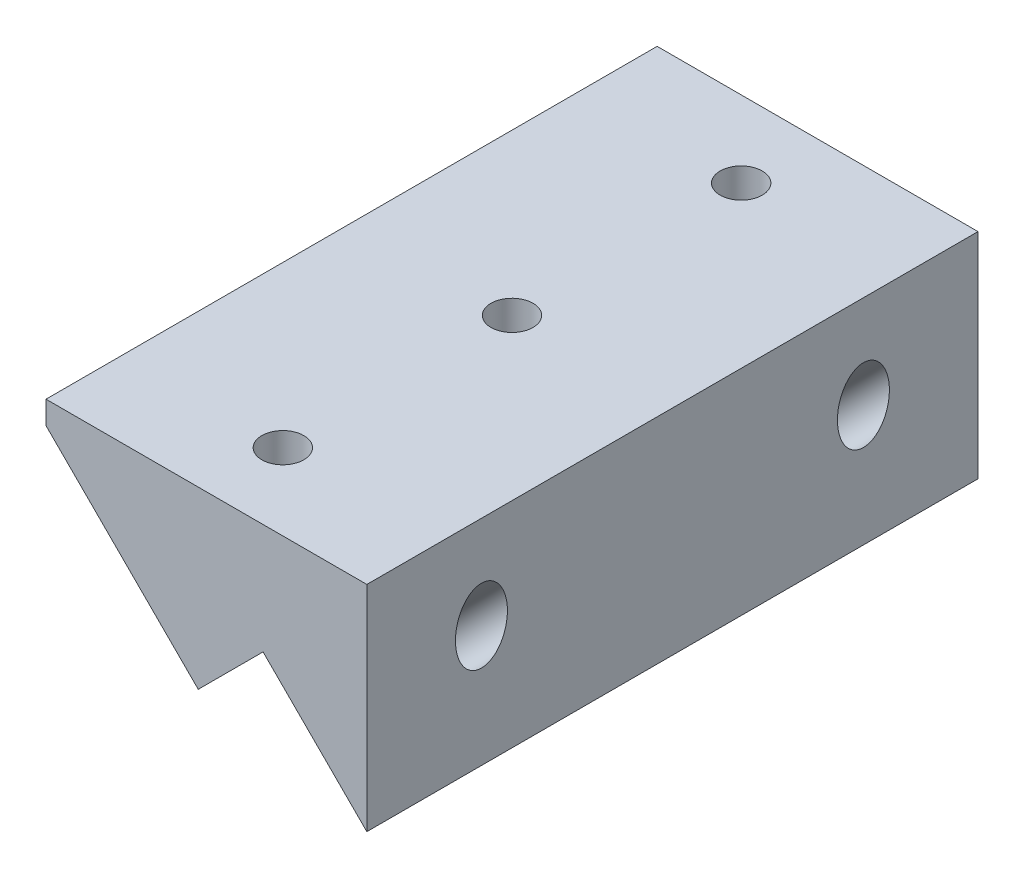
ISO-10303-21;
HEADER;
FILE_DESCRIPTION(('STEP AP214'),'2;1');
FILE_NAME('part.step','',(''),(''),'','','');
FILE_SCHEMA(('AUTOMOTIVE_DESIGN { 1 0 10303 214 1 1 1 1 }'));
ENDSEC;
DATA;
#1=APPLICATION_CONTEXT('core data for automotive mechanical design processes');
#2=APPLICATION_PROTOCOL_DEFINITION('international standard','automotive_design',2000,#1);
#3=PRODUCT_CONTEXT('',#1,'mechanical');
#4=PRODUCT('Part','Part','',(#3));
#5=PRODUCT_RELATED_PRODUCT_CATEGORY('part','',(#4));
#6=PRODUCT_DEFINITION_FORMATION('','',#4);
#7=PRODUCT_DEFINITION_CONTEXT('part definition',#1,'design');
#8=PRODUCT_DEFINITION('design','',#6,#7);
#9=PRODUCT_DEFINITION_SHAPE('','',#8);
#10=(LENGTH_UNIT() NAMED_UNIT(*) SI_UNIT(.MILLI.,.METRE.));
#11=(NAMED_UNIT(*) PLANE_ANGLE_UNIT() SI_UNIT($,.RADIAN.));
#12=(NAMED_UNIT(*) SI_UNIT($,.STERADIAN.) SOLID_ANGLE_UNIT());
#13=UNCERTAINTY_MEASURE_WITH_UNIT(LENGTH_MEASURE(1.E-05),#10,'distance_accuracy_value','');
#14=(GEOMETRIC_REPRESENTATION_CONTEXT(3) GLOBAL_UNCERTAINTY_ASSIGNED_CONTEXT((#13)) GLOBAL_UNIT_ASSIGNED_CONTEXT((#10,
#11,#12)) REPRESENTATION_CONTEXT('',''));
#15=CARTESIAN_POINT('',(0.,0.,0.));
#16=DIRECTION('',(0.,0.,1.));
#17=DIRECTION('',(1.,0.,0.));
#18=AXIS2_PLACEMENT_3D('',#15,#16,#17);
#19=CARTESIAN_POINT('',(21.,-15.,40.));
#20=DIRECTION('',(-1.,0.,0.));
#21=DIRECTION('',(0.,0.,1.));
#22=AXIS2_PLACEMENT_3D('',#19,#20,#21);
#23=PLANE('',#22);
#24=CARTESIAN_POINT('',(21.,2.82842712474589,-25.));
#25=DIRECTION('',(-1.,0.,0.));
#26=DIRECTION('',(0.,-1.,0.));
#27=AXIS2_PLACEMENT_3D('',#24,#25,#26);
#28=ELLIPSE('',#27,4.80832611206852,3.4);
#29=CARTESIAN_POINT('',(21.,-1.97989898732263,-25.));
#30=VERTEX_POINT('',#29);
#31=EDGE_CURVE('E250',#30,#30,#28,.T.);
#32=ORIENTED_EDGE('',*,*,#31,.T.);
#33=EDGE_LOOP('',(#32));
#34=FACE_BOUND('',#33,.T.);
#35=CARTESIAN_POINT('',(21.,2.82842712474589,25.));
#36=DIRECTION('',(-1.,0.,0.));
#37=DIRECTION('',(0.,-1.,0.));
#38=AXIS2_PLACEMENT_3D('',#35,#36,#37);
#39=ELLIPSE('',#38,4.80832611206852,3.4);
#40=CARTESIAN_POINT('',(21.,-1.97989898732263,25.));
#41=VERTEX_POINT('',#40);
#42=EDGE_CURVE('E134',#41,#41,#39,.T.);
#43=ORIENTED_EDGE('',*,*,#42,.T.);
#44=EDGE_LOOP('',(#43));
#45=FACE_BOUND('',#44,.T.);
#46=DIRECTION('',(0.,1.,0.));
#47=VECTOR('',#46,1.);
#48=CARTESIAN_POINT('',(21.,-15.,40.));
#49=LINE('',#48,#47);
#50=CARTESIAN_POINT('',(21.,-13.0294372515226,40.));
#51=VERTEX_POINT('',#50);
#52=CARTESIAN_POINT('',(21.,15.,40.));
#53=VERTEX_POINT('',#52);
#54=EDGE_CURVE('E184',#51,#53,#49,.T.);
#55=ORIENTED_EDGE('',*,*,#54,.F.);
#56=DIRECTION('',(0.,0.,-1.));
#57=VECTOR('',#56,1.);
#58=CARTESIAN_POINT('',(21.,-13.0294372515226,40.));
#59=LINE('',#58,#57);
#60=CARTESIAN_POINT('',(21.,-13.0294372515226,-40.));
#61=VERTEX_POINT('',#60);
#62=EDGE_CURVE('E146',#51,#61,#59,.T.);
#63=ORIENTED_EDGE('',*,*,#62,.T.);
#64=DIRECTION('',(0.,1.,0.));
#65=VECTOR('',#64,1.);
#66=CARTESIAN_POINT('',(21.,-15.,-40.));
#67=LINE('',#66,#65);
#68=CARTESIAN_POINT('',(21.,15.,-40.));
#69=VERTEX_POINT('',#68);
#70=EDGE_CURVE('E129',#61,#69,#67,.T.);
#71=ORIENTED_EDGE('',*,*,#70,.T.);
#72=DIRECTION('',(0.,0.,-1.));
#73=VECTOR('',#72,1.);
#74=CARTESIAN_POINT('',(21.,15.,40.));
#75=LINE('',#74,#73);
#76=EDGE_CURVE('E48',#53,#69,#75,.T.);
#77=ORIENTED_EDGE('',*,*,#76,.F.);
#78=EDGE_LOOP('',(#55,#63,#71,#77));
#79=FACE_BOUND('',#78,.T.);
#80=ADVANCED_FACE('F41',(#34,#45,#79),#23,.F.);
#81=CARTESIAN_POINT('',(-21.,15.,40.));
#82=DIRECTION('',(0.,-1.,0.));
#83=DIRECTION('',(0.,0.,-1.));
#84=AXIS2_PLACEMENT_3D('',#81,#82,#83);
#85=PLANE('',#84);
#86=CARTESIAN_POINT('',(0.,15.,30.));
#87=DIRECTION('',(0.,-1.,0.));
#88=DIRECTION('',(0.,0.,-1.));
#89=AXIS2_PLACEMENT_3D('',#86,#87,#88);
#90=CIRCLE('',#89,2.74999999999999);
#91=CARTESIAN_POINT('',(0.,15.,27.25));
#92=VERTEX_POINT('',#91);
#93=EDGE_CURVE('E154',#92,#92,#90,.T.);
#94=ORIENTED_EDGE('',*,*,#93,.T.);
#95=EDGE_LOOP('',(#94));
#96=FACE_BOUND('',#95,.T.);
#97=CARTESIAN_POINT('',(0.,15.,-30.));
#98=DIRECTION('',(0.,-1.,0.));
#99=DIRECTION('',(0.,0.,-1.));
#100=AXIS2_PLACEMENT_3D('',#97,#98,#99);
#101=CIRCLE('',#100,2.74999999999999);
#102=CARTESIAN_POINT('',(0.,15.,-32.75));
#103=VERTEX_POINT('',#102);
#104=EDGE_CURVE('E164',#103,#103,#101,.T.);
#105=ORIENTED_EDGE('',*,*,#104,.T.);
#106=EDGE_LOOP('',(#105));
#107=FACE_BOUND('',#106,.T.);
#108=CARTESIAN_POINT('',(0.,15.,0.));
#109=DIRECTION('',(0.,-1.,0.));
#110=DIRECTION('',(0.,0.,-1.));
#111=AXIS2_PLACEMENT_3D('',#108,#109,#110);
#112=CIRCLE('',#111,2.74999999999999);
#113=CARTESIAN_POINT('',(0.,15.,-2.74999999999999));
#114=VERTEX_POINT('',#113);
#115=EDGE_CURVE('E174',#114,#114,#112,.T.);
#116=ORIENTED_EDGE('',*,*,#115,.T.);
#117=EDGE_LOOP('',(#116));
#118=FACE_BOUND('',#117,.T.);
#119=DIRECTION('',(-1.,0.,0.));
#120=VECTOR('',#119,1.);
#121=CARTESIAN_POINT('',(-21.,15.,-40.));
#122=LINE('',#121,#120);
#123=CARTESIAN_POINT('',(-21.,15.,-40.));
#124=VERTEX_POINT('',#123);
#125=EDGE_CURVE('E194',#69,#124,#122,.T.);
#126=ORIENTED_EDGE('',*,*,#125,.T.);
#127=DIRECTION('',(0.,0.,-1.));
#128=VECTOR('',#127,1.);
#129=CARTESIAN_POINT('',(-21.,15.,40.));
#130=LINE('',#129,#128);
#131=CARTESIAN_POINT('',(-21.,15.,40.));
#132=VERTEX_POINT('',#131);
#133=EDGE_CURVE('E192',#132,#124,#130,.T.);
#134=ORIENTED_EDGE('',*,*,#133,.F.);
#135=DIRECTION('',(-1.,0.,0.));
#136=VECTOR('',#135,1.);
#137=CARTESIAN_POINT('',(-21.,15.,40.));
#138=LINE('',#137,#136);
#139=EDGE_CURVE('E186',#53,#132,#138,.T.);
#140=ORIENTED_EDGE('',*,*,#139,.F.);
#141=ORIENTED_EDGE('',*,*,#76,.T.);
#142=EDGE_LOOP('',(#126,#134,#140,#141));
#143=FACE_BOUND('',#142,.T.);
#144=ADVANCED_FACE('F240',(#96,#107,#118,#143),#85,.F.);
#145=CARTESIAN_POINT('',(-21.,-15.,40.));
#146=DIRECTION('',(1.,0.,0.));
#147=DIRECTION('',(0.,0.,-1.));
#148=AXIS2_PLACEMENT_3D('',#145,#146,#147);
#149=PLANE('',#148);
#150=DIRECTION('',(0.,-1.,0.));
#151=VECTOR('',#150,1.);
#152=CARTESIAN_POINT('',(-21.,-15.,-40.));
#153=LINE('',#152,#151);
#154=CARTESIAN_POINT('',(-21.,12.,-40.));
#155=VERTEX_POINT('',#154);
#156=EDGE_CURVE('E187',#124,#155,#153,.T.);
#157=ORIENTED_EDGE('',*,*,#156,.T.);
#158=DIRECTION('',(0.,0.,1.));
#159=VECTOR('',#158,1.);
#160=CARTESIAN_POINT('',(-21.,12.,-40.));
#161=LINE('',#160,#159);
#162=CARTESIAN_POINT('',(-21.,12.,40.));
#163=VERTEX_POINT('',#162);
#164=EDGE_CURVE('E179',#155,#163,#161,.T.);
#165=ORIENTED_EDGE('',*,*,#164,.T.);
#166=DIRECTION('',(0.,-1.,0.));
#167=VECTOR('',#166,1.);
#168=CARTESIAN_POINT('',(-21.,-15.,40.));
#169=LINE('',#168,#167);
#170=EDGE_CURVE('E189',#132,#163,#169,.T.);
#171=ORIENTED_EDGE('',*,*,#170,.F.);
#172=ORIENTED_EDGE('',*,*,#133,.T.);
#173=EDGE_LOOP('',(#157,#165,#171,#172));
#174=FACE_BOUND('',#173,.T.);
#175=ADVANCED_FACE('F245',(#174),#149,.F.);
#176=CARTESIAN_POINT('',(0.,0.,40.));
#177=DIRECTION('',(0.,0.,-1.));
#178=DIRECTION('',(-1.,0.,0.));
#179=AXIS2_PLACEMENT_3D('',#176,#177,#178);
#180=PLANE('',#179);
#181=DIRECTION('',(-0.707106781186552,0.707106781186544,0.));
#182=VECTOR('',#181,1.);
#183=CARTESIAN_POINT('',(-21.,12.,40.));
#184=LINE('',#183,#182);
#185=CARTESIAN_POINT('',(-1.07106781186517,-7.92893218813453,40.));
#186=VERTEX_POINT('',#185);
#187=EDGE_CURVE('E180',#186,#163,#184,.T.);
#188=ORIENTED_EDGE('',*,*,#187,.F.);
#189=DIRECTION('',(-0.707106781186547,-0.707106781186548,0.));
#190=VECTOR('',#189,1.);
#191=CARTESIAN_POINT('',(-1.07106781186517,-7.92893218813453,40.));
#192=LINE('',#191,#190);
#193=CARTESIAN_POINT('',(7.4142135623734,0.556349186104048,40.));
#194=VERTEX_POINT('',#193);
#195=EDGE_CURVE('E130',#194,#186,#192,.T.);
#196=ORIENTED_EDGE('',*,*,#195,.F.);
#197=DIRECTION('',(-0.707106781186548,0.707106781186547,0.));
#198=VECTOR('',#197,1.);
#199=CARTESIAN_POINT('',(7.4142135623734,0.556349186104048,40.));
#200=LINE('',#199,#198);
#201=EDGE_CURVE('E118',#51,#194,#200,.T.);
#202=ORIENTED_EDGE('',*,*,#201,.F.);
#203=ORIENTED_EDGE('',*,*,#54,.T.);
#204=ORIENTED_EDGE('',*,*,#139,.T.);
#205=ORIENTED_EDGE('',*,*,#170,.T.);
#206=EDGE_LOOP('',(#188,#196,#202,#203,#204,#205));
#207=FACE_BOUND('',#206,.T.);
#208=ADVANCED_FACE('F258',(#207),#180,.F.);
#209=CARTESIAN_POINT('',(0.,0.,-40.));
#210=DIRECTION('',(0.,0.,-1.));
#211=DIRECTION('',(-1.,0.,0.));
#212=AXIS2_PLACEMENT_3D('',#209,#210,#211);
#213=PLANE('',#212);
#214=DIRECTION('',(-0.707106781186547,-0.707106781186548,0.));
#215=VECTOR('',#214,1.);
#216=CARTESIAN_POINT('',(-1.07106781186517,-7.92893218813453,-40.));
#217=LINE('',#216,#215);
#218=CARTESIAN_POINT('',(7.4142135623734,0.556349186104048,-40.));
#219=VERTEX_POINT('',#218);
#220=CARTESIAN_POINT('',(-1.07106781186517,-7.92893218813453,-40.));
#221=VERTEX_POINT('',#220);
#222=EDGE_CURVE('E120',#219,#221,#217,.T.);
#223=ORIENTED_EDGE('',*,*,#222,.T.);
#224=DIRECTION('',(-0.707106781186552,0.707106781186544,0.));
#225=VECTOR('',#224,1.);
#226=CARTESIAN_POINT('',(-21.,12.,-40.));
#227=LINE('',#226,#225);
#228=EDGE_CURVE('E62',#221,#155,#227,.T.);
#229=ORIENTED_EDGE('',*,*,#228,.T.);
#230=ORIENTED_EDGE('',*,*,#156,.F.);
#231=ORIENTED_EDGE('',*,*,#125,.F.);
#232=ORIENTED_EDGE('',*,*,#70,.F.);
#233=DIRECTION('',(-0.707106781186548,0.707106781186547,0.));
#234=VECTOR('',#233,1.);
#235=CARTESIAN_POINT('',(7.4142135623734,0.556349186104048,-40.));
#236=LINE('',#235,#234);
#237=EDGE_CURVE('E115',#61,#219,#236,.T.);
#238=ORIENTED_EDGE('',*,*,#237,.T.);
#239=EDGE_LOOP('',(#223,#229,#230,#231,#232,#238));
#240=FACE_BOUND('',#239,.T.);
#241=ADVANCED_FACE('F127',(#240),#213,.T.);
#242=CARTESIAN_POINT('',(-21.,12.,-40.));
#243=DIRECTION('',(0.707106781186544,0.707106781186552,0.));
#244=DIRECTION('',(-0.707106781186552,0.707106781186544,0.));
#245=AXIS2_PLACEMENT_3D('',#242,#243,#244);
#246=PLANE('',#245);
#247=ORIENTED_EDGE('',*,*,#228,.F.);
#248=DIRECTION('',(0.,0.,1.));
#249=VECTOR('',#248,1.);
#250=CARTESIAN_POINT('',(-1.07106781186517,-7.92893218813453,-40.));
#251=LINE('',#250,#249);
#252=CARTESIAN_POINT('',(-1.07106781186517,-7.92893218813453,-34.8839342483684));
#253=VERTEX_POINT('',#252);
#254=EDGE_CURVE('E124',#221,#253,#251,.T.);
#255=ORIENTED_EDGE('',*,*,#254,.T.);
#256=CARTESIAN_POINT('',(0.,-8.99999999999975,-30.));
#257=DIRECTION('',(0.707106781186544,0.707106781186552,0.));
#258=DIRECTION('',(0.707106781186552,-0.707106781186544,0.));
#259=AXIS2_PLACEMENT_3D('',#256,#257,#258);
#260=ELLIPSE('',#259,7.07106781186543,5.);
#261=CARTESIAN_POINT('',(-1.07106781186517,-7.92893218813453,-25.1160657516315));
#262=VERTEX_POINT('',#261);
#263=EDGE_CURVE('E167',#253,#262,#260,.T.);
#264=ORIENTED_EDGE('',*,*,#263,.T.);
#265=CARTESIAN_POINT('',(-1.07106781186517,-7.92893218813453,-4.88393424836845));
#266=VERTEX_POINT('',#265);
#267=EDGE_CURVE('E139',#262,#266,#251,.T.);
#268=ORIENTED_EDGE('',*,*,#267,.T.);
#269=CARTESIAN_POINT('',(0.,-8.99999999999976,0.));
#270=DIRECTION('',(0.707106781186544,0.707106781186552,0.));
#271=DIRECTION('',(0.707106781186552,-0.707106781186544,0.));
#272=AXIS2_PLACEMENT_3D('',#269,#270,#271);
#273=ELLIPSE('',#272,7.07106781186543,5.);
#274=CARTESIAN_POINT('',(-1.07106781186517,-7.92893218813453,4.88393424836845));
#275=VERTEX_POINT('',#274);
#276=EDGE_CURVE('E177',#266,#275,#273,.T.);
#277=ORIENTED_EDGE('',*,*,#276,.T.);
#278=CARTESIAN_POINT('',(-1.07106781186517,-7.92893218813453,25.1160657516315));
#279=VERTEX_POINT('',#278);
#280=EDGE_CURVE('E211',#275,#279,#251,.T.);
#281=ORIENTED_EDGE('',*,*,#280,.T.);
#282=CARTESIAN_POINT('',(0.,-8.99999999999975,30.));
#283=DIRECTION('',(0.707106781186544,0.707106781186552,0.));
#284=DIRECTION('',(0.707106781186552,-0.707106781186544,0.));
#285=AXIS2_PLACEMENT_3D('',#282,#283,#284);
#286=ELLIPSE('',#285,7.07106781186543,5.);
#287=CARTESIAN_POINT('',(-1.07106781186521,-7.92893218813456,34.8839342483684));
#288=VERTEX_POINT('',#287);
#289=EDGE_CURVE('E157',#279,#288,#286,.T.);
#290=ORIENTED_EDGE('',*,*,#289,.T.);
#291=EDGE_CURVE('E55',#288,#186,#251,.T.);
#292=ORIENTED_EDGE('',*,*,#291,.T.);
#293=ORIENTED_EDGE('',*,*,#187,.T.);
#294=ORIENTED_EDGE('',*,*,#164,.F.);
#295=EDGE_LOOP('',(#247,#255,#264,#268,#277,#281,#290,#292,#293,#294));
#296=FACE_BOUND('',#295,.T.);
#297=ADVANCED_FACE('F209',(#296),#246,.F.);
#298=CARTESIAN_POINT('',(0.,-15.,0.));
#299=DIRECTION('',(0.,-1.,0.));
#300=DIRECTION('',(0.,0.,-1.));
#301=AXIS2_PLACEMENT_3D('',#298,#299,#300);
#302=CYLINDRICAL_SURFACE('',#301,5.);
#303=CARTESIAN_POINT('',(0.,8.,0.));
#304=DIRECTION('',(0.,-1.,0.));
#305=DIRECTION('',(0.,0.,-1.));
#306=AXIS2_PLACEMENT_3D('',#303,#304,#305);
#307=CIRCLE('',#306,4.99999999999999);
#308=CARTESIAN_POINT('',(0.,8.,-4.99999999999999));
#309=VERTEX_POINT('',#308);
#310=EDGE_CURVE('E168',#309,#309,#307,.T.);
#311=ORIENTED_EDGE('',*,*,#310,.F.);
#312=EDGE_LOOP('',(#311));
#313=FACE_BOUND('',#312,.T.);
#314=ORIENTED_EDGE('',*,*,#276,.F.);
#315=CARTESIAN_POINT('',(0.,-6.85786437626936,0.));
#316=DIRECTION('',(-0.707106781186548,0.707106781186547,0.));
#317=DIRECTION('',(-0.707106781186547,-0.707106781186548,0.));
#318=AXIS2_PLACEMENT_3D('',#315,#316,#317);
#319=ELLIPSE('',#318,7.07106781186547,5.);
#320=EDGE_CURVE('E143',#266,#275,#319,.F.);
#321=ORIENTED_EDGE('',*,*,#320,.T.);
#322=EDGE_LOOP('',(#314,#321));
#323=FACE_BOUND('',#322,.T.);
#324=ADVANCED_FACE('F217',(#313,#323),#302,.F.);
#325=CARTESIAN_POINT('',(0.,-15.,0.));
#326=DIRECTION('',(0.,-1.,0.));
#327=DIRECTION('',(0.,0.,-1.));
#328=AXIS2_PLACEMENT_3D('',#325,#326,#327);
#329=CYLINDRICAL_SURFACE('',#328,2.74999999999999);
#330=ORIENTED_EDGE('',*,*,#115,.F.);
#331=EDGE_LOOP('',(#330));
#332=FACE_BOUND('',#331,.T.);
#333=CARTESIAN_POINT('',(0.,8.,0.));
#334=DIRECTION('',(0.,-1.,0.));
#335=DIRECTION('',(0.,0.,-1.));
#336=AXIS2_PLACEMENT_3D('',#333,#334,#335);
#337=CIRCLE('',#336,2.75);
#338=CARTESIAN_POINT('',(0.,8.,-2.75));
#339=VERTEX_POINT('',#338);
#340=EDGE_CURVE('E171',#339,#339,#337,.T.);
#341=ORIENTED_EDGE('',*,*,#340,.T.);
#342=EDGE_LOOP('',(#341));
#343=FACE_BOUND('',#342,.T.);
#344=ADVANCED_FACE('F233',(#332,#343),#329,.F.);
#345=CARTESIAN_POINT('',(2.75,8.,0.));
#346=DIRECTION('',(0.,1.,0.));
#347=DIRECTION('',(0.,0.,1.));
#348=AXIS2_PLACEMENT_3D('',#345,#346,#347);
#349=PLANE('',#348);
#350=ORIENTED_EDGE('',*,*,#340,.F.);
#351=EDGE_LOOP('',(#350));
#352=FACE_BOUND('',#351,.T.);
#353=ORIENTED_EDGE('',*,*,#310,.T.);
#354=EDGE_LOOP('',(#353));
#355=FACE_BOUND('',#354,.T.);
#356=ADVANCED_FACE('F223',(#352,#355),#349,.F.);
#357=CARTESIAN_POINT('',(0.,-15.,-30.));
#358=DIRECTION('',(0.,-1.,0.));
#359=DIRECTION('',(0.,0.,-1.));
#360=AXIS2_PLACEMENT_3D('',#357,#358,#359);
#361=CYLINDRICAL_SURFACE('',#360,5.);
#362=CARTESIAN_POINT('',(0.,8.,-30.));
#363=DIRECTION('',(0.,-1.,0.));
#364=DIRECTION('',(0.,0.,-1.));
#365=AXIS2_PLACEMENT_3D('',#362,#363,#364);
#366=CIRCLE('',#365,4.99999999999999);
#367=CARTESIAN_POINT('',(0.,8.,-35.));
#368=VERTEX_POINT('',#367);
#369=EDGE_CURVE('E158',#368,#368,#366,.T.);
#370=ORIENTED_EDGE('',*,*,#369,.F.);
#371=EDGE_LOOP('',(#370));
#372=FACE_BOUND('',#371,.T.);
#373=ORIENTED_EDGE('',*,*,#263,.F.);
#374=CARTESIAN_POINT('',(0.,-6.85786437626936,-30.));
#375=DIRECTION('',(-0.707106781186548,0.707106781186547,0.));
#376=DIRECTION('',(-0.707106781186547,-0.707106781186548,0.));
#377=AXIS2_PLACEMENT_3D('',#374,#375,#376);
#378=ELLIPSE('',#377,7.07106781186547,5.);
#379=EDGE_CURVE('E138',#253,#262,#378,.F.);
#380=ORIENTED_EDGE('',*,*,#379,.T.);
#381=EDGE_LOOP('',(#373,#380));
#382=FACE_BOUND('',#381,.T.);
#383=ADVANCED_FACE('F220',(#372,#382),#361,.F.);
#384=CARTESIAN_POINT('',(0.,-15.,-30.));
#385=DIRECTION('',(0.,-1.,0.));
#386=DIRECTION('',(0.,0.,-1.));
#387=AXIS2_PLACEMENT_3D('',#384,#385,#386);
#388=CYLINDRICAL_SURFACE('',#387,2.74999999999999);
#389=ORIENTED_EDGE('',*,*,#104,.F.);
#390=EDGE_LOOP('',(#389));
#391=FACE_BOUND('',#390,.T.);
#392=CARTESIAN_POINT('',(0.,8.,-30.));
#393=DIRECTION('',(0.,-1.,0.));
#394=DIRECTION('',(0.,0.,-1.));
#395=AXIS2_PLACEMENT_3D('',#392,#393,#394);
#396=CIRCLE('',#395,2.75);
#397=CARTESIAN_POINT('',(0.,8.,-32.75));
#398=VERTEX_POINT('',#397);
#399=EDGE_CURVE('E161',#398,#398,#396,.T.);
#400=ORIENTED_EDGE('',*,*,#399,.T.);
#401=EDGE_LOOP('',(#400));
#402=FACE_BOUND('',#401,.T.);
#403=ADVANCED_FACE('F222',(#391,#402),#388,.F.);
#404=CARTESIAN_POINT('',(2.74999999999999,8.,-30.));
#405=DIRECTION('',(0.,1.,0.));
#406=DIRECTION('',(0.,0.,1.));
#407=AXIS2_PLACEMENT_3D('',#404,#405,#406);
#408=PLANE('',#407);
#409=ORIENTED_EDGE('',*,*,#399,.F.);
#410=EDGE_LOOP('',(#409));
#411=FACE_BOUND('',#410,.T.);
#412=ORIENTED_EDGE('',*,*,#369,.T.);
#413=EDGE_LOOP('',(#412));
#414=FACE_BOUND('',#413,.T.);
#415=ADVANCED_FACE('F230',(#411,#414),#408,.F.);
#416=CARTESIAN_POINT('',(0.,-15.,30.));
#417=DIRECTION('',(0.,-1.,0.));
#418=DIRECTION('',(0.,0.,-1.));
#419=AXIS2_PLACEMENT_3D('',#416,#417,#418);
#420=CYLINDRICAL_SURFACE('',#419,5.);
#421=CARTESIAN_POINT('',(0.,8.,30.));
#422=DIRECTION('',(0.,-1.,0.));
#423=DIRECTION('',(0.,0.,-1.));
#424=AXIS2_PLACEMENT_3D('',#421,#422,#423);
#425=CIRCLE('',#424,4.99999999999999);
#426=CARTESIAN_POINT('',(0.,8.,25.));
#427=VERTEX_POINT('',#426);
#428=EDGE_CURVE('E148',#427,#427,#425,.T.);
#429=ORIENTED_EDGE('',*,*,#428,.F.);
#430=EDGE_LOOP('',(#429));
#431=FACE_BOUND('',#430,.T.);
#432=ORIENTED_EDGE('',*,*,#289,.F.);
#433=CARTESIAN_POINT('',(0.,-6.85786437626936,30.));
#434=DIRECTION('',(-0.707106781186548,0.707106781186547,0.));
#435=DIRECTION('',(-0.707106781186547,-0.707106781186548,0.));
#436=AXIS2_PLACEMENT_3D('',#433,#434,#435);
#437=ELLIPSE('',#436,7.07106781186547,5.);
#438=EDGE_CURVE('E11',#279,#288,#437,.F.);
#439=ORIENTED_EDGE('',*,*,#438,.T.);
#440=EDGE_LOOP('',(#432,#439));
#441=FACE_BOUND('',#440,.T.);
#442=ADVANCED_FACE('F213',(#431,#441),#420,.F.);
#443=CARTESIAN_POINT('',(0.,-15.,30.));
#444=DIRECTION('',(0.,-1.,0.));
#445=DIRECTION('',(0.,0.,-1.));
#446=AXIS2_PLACEMENT_3D('',#443,#444,#445);
#447=CYLINDRICAL_SURFACE('',#446,2.74999999999999);
#448=ORIENTED_EDGE('',*,*,#93,.F.);
#449=EDGE_LOOP('',(#448));
#450=FACE_BOUND('',#449,.T.);
#451=CARTESIAN_POINT('',(0.,8.,30.));
#452=DIRECTION('',(0.,-1.,0.));
#453=DIRECTION('',(0.,0.,-1.));
#454=AXIS2_PLACEMENT_3D('',#451,#452,#453);
#455=CIRCLE('',#454,2.75);
#456=CARTESIAN_POINT('',(0.,8.,27.25));
#457=VERTEX_POINT('',#456);
#458=EDGE_CURVE('E151',#457,#457,#455,.T.);
#459=ORIENTED_EDGE('',*,*,#458,.T.);
#460=EDGE_LOOP('',(#459));
#461=FACE_BOUND('',#460,.T.);
#462=ADVANCED_FACE('F284',(#450,#461),#447,.F.);
#463=CARTESIAN_POINT('',(2.74999999999999,8.,30.));
#464=DIRECTION('',(0.,1.,0.));
#465=DIRECTION('',(0.,0.,1.));
#466=AXIS2_PLACEMENT_3D('',#463,#464,#465);
#467=PLANE('',#466);
#468=ORIENTED_EDGE('',*,*,#458,.F.);
#469=EDGE_LOOP('',(#468));
#470=FACE_BOUND('',#469,.T.);
#471=ORIENTED_EDGE('',*,*,#428,.T.);
#472=EDGE_LOOP('',(#471));
#473=FACE_BOUND('',#472,.T.);
#474=ADVANCED_FACE('F293',(#470,#473),#467,.F.);
#475=CARTESIAN_POINT('',(7.4142135623734,0.556349186104048,-40.));
#476=DIRECTION('',(0.707106781186547,0.707106781186548,0.));
#477=DIRECTION('',(-0.707106781186548,0.707106781186547,0.));
#478=AXIS2_PLACEMENT_3D('',#475,#476,#477);
#479=PLANE('',#478);
#480=CARTESIAN_POINT('',(13.0710678118658,-5.10050506338833,-25.));
#481=DIRECTION('',(-0.707106781186547,-0.707106781186548,0.));
#482=DIRECTION('',(0.707106781186548,-0.707106781186547,0.));
#483=AXIS2_PLACEMENT_3D('',#480,#481,#482);
#484=CIRCLE('',#483,3.4);
#485=CARTESIAN_POINT('',(15.4752308679,-7.50466811942259,-25.));
#486=VERTEX_POINT('',#485);
#487=EDGE_CURVE('E315',#486,#486,#484,.T.);
#488=ORIENTED_EDGE('',*,*,#487,.F.);
#489=EDGE_LOOP('',(#488));
#490=FACE_BOUND('',#489,.T.);
#491=CARTESIAN_POINT('',(13.0710678118658,-5.10050506338833,25.));
#492=DIRECTION('',(-0.707106781186547,-0.707106781186548,0.));
#493=DIRECTION('',(0.707106781186548,-0.707106781186547,0.));
#494=AXIS2_PLACEMENT_3D('',#491,#492,#493);
#495=CIRCLE('',#494,3.4);
#496=CARTESIAN_POINT('',(15.4752308679,-7.50466811942259,25.));
#497=VERTEX_POINT('',#496);
#498=EDGE_CURVE('E318',#497,#497,#495,.T.);
#499=ORIENTED_EDGE('',*,*,#498,.F.);
#500=EDGE_LOOP('',(#499));
#501=FACE_BOUND('',#500,.T.);
#502=ORIENTED_EDGE('',*,*,#201,.T.);
#503=DIRECTION('',(0.,0.,1.));
#504=VECTOR('',#503,1.);
#505=CARTESIAN_POINT('',(7.4142135623734,0.556349186104048,-40.));
#506=LINE('',#505,#504);
#507=EDGE_CURVE('E111',#219,#194,#506,.T.);
#508=ORIENTED_EDGE('',*,*,#507,.F.);
#509=ORIENTED_EDGE('',*,*,#237,.F.);
#510=ORIENTED_EDGE('',*,*,#62,.F.);
#511=EDGE_LOOP('',(#502,#508,#509,#510));
#512=FACE_BOUND('',#511,.T.);
#513=ADVANCED_FACE('F113',(#490,#501,#512),#479,.F.);
#514=CARTESIAN_POINT('',(-1.07106781186517,-7.92893218813453,-40.));
#515=DIRECTION('',(-0.707106781186548,0.707106781186547,0.));
#516=DIRECTION('',(-0.707106781186547,-0.707106781186548,0.));
#517=AXIS2_PLACEMENT_3D('',#514,#515,#516);
#518=PLANE('',#517);
#519=ORIENTED_EDGE('',*,*,#267,.F.);
#520=ORIENTED_EDGE('',*,*,#379,.F.);
#521=ORIENTED_EDGE('',*,*,#254,.F.);
#522=ORIENTED_EDGE('',*,*,#222,.F.);
#523=ORIENTED_EDGE('',*,*,#507,.T.);
#524=ORIENTED_EDGE('',*,*,#195,.T.);
#525=ORIENTED_EDGE('',*,*,#291,.F.);
#526=ORIENTED_EDGE('',*,*,#438,.F.);
#527=ORIENTED_EDGE('',*,*,#280,.F.);
#528=ORIENTED_EDGE('',*,*,#320,.F.);
#529=EDGE_LOOP('',(#519,#520,#521,#522,#523,#524,#525,#526,#527,#528));
#530=FACE_BOUND('',#529,.T.);
#531=ADVANCED_FACE('F122',(#530),#518,.F.);
#532=CARTESIAN_POINT('',(13.0710678118658,-5.10050506338833,25.));
#533=DIRECTION('',(-0.707106781186547,-0.707106781186548,0.));
#534=DIRECTION('',(0.707106781186548,-0.707106781186547,0.));
#535=AXIS2_PLACEMENT_3D('',#532,#533,#534);
#536=CYLINDRICAL_SURFACE('',#535,3.4);
#537=ORIENTED_EDGE('',*,*,#498,.T.);
#538=EDGE_LOOP('',(#537));
#539=FACE_BOUND('',#538,.T.);
#540=ORIENTED_EDGE('',*,*,#42,.F.);
#541=EDGE_LOOP('',(#540));
#542=FACE_BOUND('',#541,.T.);
#543=ADVANCED_FACE('F311',(#539,#542),#536,.F.);
#544=CARTESIAN_POINT('',(13.0710678118658,-5.10050506338833,-25.));
#545=DIRECTION('',(-0.707106781186547,-0.707106781186548,0.));
#546=DIRECTION('',(0.707106781186548,-0.707106781186547,0.));
#547=AXIS2_PLACEMENT_3D('',#544,#545,#546);
#548=CYLINDRICAL_SURFACE('',#547,3.4);
#549=ORIENTED_EDGE('',*,*,#487,.T.);
#550=EDGE_LOOP('',(#549));
#551=FACE_BOUND('',#550,.T.);
#552=ORIENTED_EDGE('',*,*,#31,.F.);
#553=EDGE_LOOP('',(#552));
#554=FACE_BOUND('',#553,.T.);
#555=ADVANCED_FACE('F323',(#551,#554),#548,.F.);
#556=CLOSED_SHELL('',(#80,#144,#175,#208,#241,#297,#324,#344,#356,#383,#403,#415,#442,#462,#474,
#513,#531,#543,#555));
#557=MANIFOLD_SOLID_BREP('B2',#556);
#558=ADVANCED_BREP_SHAPE_REPRESENTATION('',(#18,#557),#14);
#559=SHAPE_DEFINITION_REPRESENTATION(#9,#558);
ENDSEC;
END-ISO-10303-21;
